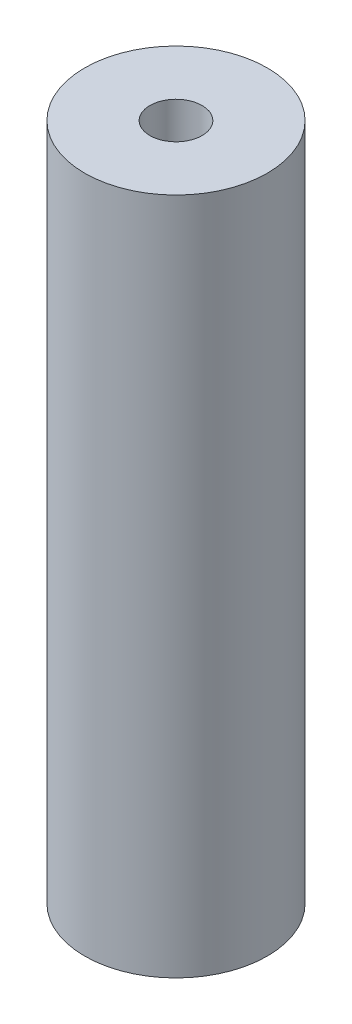
ISO-10303-21;
HEADER;
FILE_DESCRIPTION(('STEP AP214'),'2;1');
FILE_NAME('part.step','',(''),(''),'','','');
FILE_SCHEMA(('AUTOMOTIVE_DESIGN { 1 0 10303 214 1 1 1 1 }'));
ENDSEC;
DATA;
#1=APPLICATION_CONTEXT('core data for automotive mechanical design processes');
#2=APPLICATION_PROTOCOL_DEFINITION('international standard','automotive_design',2000,#1);
#3=PRODUCT_CONTEXT('',#1,'mechanical');
#4=PRODUCT('Part','Part','',(#3));
#5=PRODUCT_RELATED_PRODUCT_CATEGORY('part','',(#4));
#6=PRODUCT_DEFINITION_FORMATION('','',#4);
#7=PRODUCT_DEFINITION_CONTEXT('part definition',#1,'design');
#8=PRODUCT_DEFINITION('design','',#6,#7);
#9=PRODUCT_DEFINITION_SHAPE('','',#8);
#10=(LENGTH_UNIT() NAMED_UNIT(*) SI_UNIT(.MILLI.,.METRE.));
#11=(NAMED_UNIT(*) PLANE_ANGLE_UNIT() SI_UNIT($,.RADIAN.));
#12=(NAMED_UNIT(*) SI_UNIT($,.STERADIAN.) SOLID_ANGLE_UNIT());
#13=UNCERTAINTY_MEASURE_WITH_UNIT(LENGTH_MEASURE(1.E-05),#10,'distance_accuracy_value','');
#14=(GEOMETRIC_REPRESENTATION_CONTEXT(3) GLOBAL_UNCERTAINTY_ASSIGNED_CONTEXT((#13)) GLOBAL_UNIT_ASSIGNED_CONTEXT((#10,
#11,#12)) REPRESENTATION_CONTEXT('',''));
#15=CARTESIAN_POINT('',(0.,0.,0.));
#16=DIRECTION('',(0.,0.,1.));
#17=DIRECTION('',(1.,0.,0.));
#18=AXIS2_PLACEMENT_3D('',#15,#16,#17);
#19=CARTESIAN_POINT('',(0.,65.,0.));
#20=DIRECTION('',(0.,-1.,0.));
#21=DIRECTION('',(0.,0.,-1.));
#22=AXIS2_PLACEMENT_3D('',#19,#20,#21);
#23=CYLINDRICAL_SURFACE('',#22,8.75);
#24=CARTESIAN_POINT('',(0.,65.,0.));
#25=DIRECTION('',(0.,1.,0.));
#26=DIRECTION('',(0.,0.,1.));
#27=AXIS2_PLACEMENT_3D('',#24,#25,#26);
#28=CIRCLE('',#27,8.75);
#29=CARTESIAN_POINT('',(0.,65.,8.75));
#30=VERTEX_POINT('',#29);
#31=EDGE_CURVE('E10',#30,#30,#28,.T.);
#32=ORIENTED_EDGE('',*,*,#31,.F.);
#33=EDGE_LOOP('',(#32));
#34=FACE_BOUND('',#33,.T.);
#35=CARTESIAN_POINT('',(0.,0.,0.));
#36=DIRECTION('',(0.,1.,0.));
#37=DIRECTION('',(0.,0.,1.));
#38=AXIS2_PLACEMENT_3D('',#35,#36,#37);
#39=CIRCLE('',#38,8.75);
#40=CARTESIAN_POINT('',(0.,0.,8.75));
#41=VERTEX_POINT('',#40);
#42=EDGE_CURVE('E33',#41,#41,#39,.T.);
#43=ORIENTED_EDGE('',*,*,#42,.T.);
#44=EDGE_LOOP('',(#43));
#45=FACE_BOUND('',#44,.T.);
#46=ADVANCED_FACE('F30',(#34,#45),#23,.T.);
#47=CARTESIAN_POINT('',(0.,65.,0.));
#48=DIRECTION('',(0.,1.,0.));
#49=DIRECTION('',(0.,0.,1.));
#50=AXIS2_PLACEMENT_3D('',#47,#48,#49);
#51=PLANE('',#50);
#52=CARTESIAN_POINT('',(0.,65.,0.));
#53=DIRECTION('',(0.,1.,0.));
#54=DIRECTION('',(0.,0.,1.));
#55=AXIS2_PLACEMENT_3D('',#52,#53,#54);
#56=CIRCLE('',#55,2.5);
#57=CARTESIAN_POINT('',(0.,65.,2.5));
#58=VERTEX_POINT('',#57);
#59=EDGE_CURVE('E40',#58,#58,#56,.F.);
#60=ORIENTED_EDGE('',*,*,#59,.T.);
#61=EDGE_LOOP('',(#60));
#62=FACE_BOUND('',#61,.T.);
#63=ORIENTED_EDGE('',*,*,#31,.T.);
#64=EDGE_LOOP('',(#63));
#65=FACE_BOUND('',#64,.T.);
#66=ADVANCED_FACE('F58',(#62,#65),#51,.T.);
#67=CARTESIAN_POINT('',(0.,0.,0.));
#68=DIRECTION('',(0.,1.,0.));
#69=DIRECTION('',(0.,0.,1.));
#70=AXIS2_PLACEMENT_3D('',#67,#68,#69);
#71=PLANE('',#70);
#72=CARTESIAN_POINT('',(0.,0.,0.));
#73=DIRECTION('',(0.,1.,0.));
#74=DIRECTION('',(0.,0.,1.));
#75=AXIS2_PLACEMENT_3D('',#72,#73,#74);
#76=CIRCLE('',#75,2.5);
#77=CARTESIAN_POINT('',(0.,0.,2.5));
#78=VERTEX_POINT('',#77);
#79=EDGE_CURVE('E44',#78,#78,#76,.T.);
#80=ORIENTED_EDGE('',*,*,#79,.T.);
#81=EDGE_LOOP('',(#80));
#82=FACE_BOUND('',#81,.T.);
#83=ORIENTED_EDGE('',*,*,#42,.F.);
#84=EDGE_LOOP('',(#83));
#85=FACE_BOUND('',#84,.T.);
#86=ADVANCED_FACE('F48',(#82,#85),#71,.F.);
#87=CARTESIAN_POINT('',(0.,131.,0.));
#88=DIRECTION('',(0.,-1.,0.));
#89=DIRECTION('',(0.,0.,-1.));
#90=AXIS2_PLACEMENT_3D('',#87,#88,#89);
#91=CYLINDRICAL_SURFACE('',#90,2.5);
#92=ORIENTED_EDGE('',*,*,#59,.F.);
#93=EDGE_LOOP('',(#92));
#94=FACE_BOUND('',#93,.T.);
#95=ORIENTED_EDGE('',*,*,#79,.F.);
#96=EDGE_LOOP('',(#95));
#97=FACE_BOUND('',#96,.T.);
#98=ADVANCED_FACE('F51',(#94,#97),#91,.F.);
#99=CLOSED_SHELL('',(#46,#66,#86,#98));
#100=MANIFOLD_SOLID_BREP('B2',#99);
#101=ADVANCED_BREP_SHAPE_REPRESENTATION('',(#18,#100),#14);
#102=SHAPE_DEFINITION_REPRESENTATION(#9,#101);
ENDSEC;
END-ISO-10303-21;
